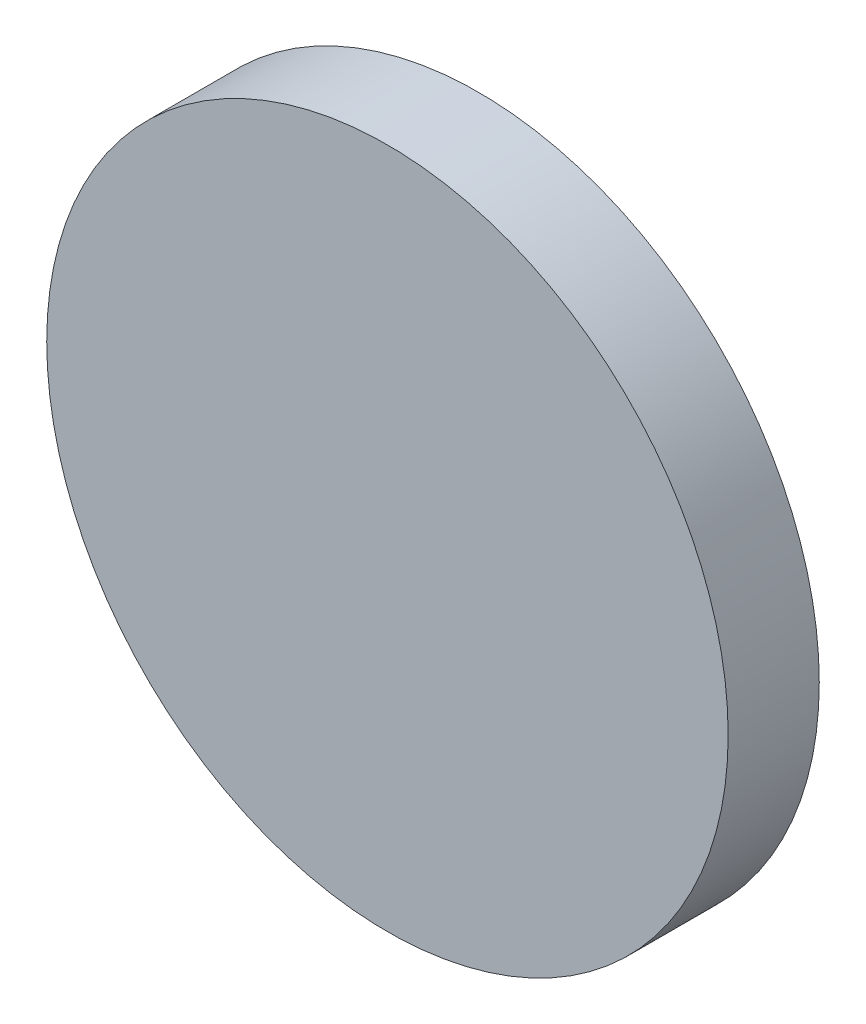
ISO-10303-21;
HEADER;
FILE_DESCRIPTION(('STEP AP214'),'2;1');
FILE_NAME('part.step','',(''),(''),'','','');
FILE_SCHEMA(('AUTOMOTIVE_DESIGN { 1 0 10303 214 1 1 1 1 }'));
ENDSEC;
DATA;
#1=APPLICATION_CONTEXT('core data for automotive mechanical design processes');
#2=APPLICATION_PROTOCOL_DEFINITION('international standard','automotive_design',2000,#1);
#3=PRODUCT_CONTEXT('',#1,'mechanical');
#4=PRODUCT('Part','Part','',(#3));
#5=PRODUCT_RELATED_PRODUCT_CATEGORY('part','',(#4));
#6=PRODUCT_DEFINITION_FORMATION('','',#4);
#7=PRODUCT_DEFINITION_CONTEXT('part definition',#1,'design');
#8=PRODUCT_DEFINITION('design','',#6,#7);
#9=PRODUCT_DEFINITION_SHAPE('','',#8);
#10=(LENGTH_UNIT() NAMED_UNIT(*) SI_UNIT(.MILLI.,.METRE.));
#11=(NAMED_UNIT(*) PLANE_ANGLE_UNIT() SI_UNIT($,.RADIAN.));
#12=(NAMED_UNIT(*) SI_UNIT($,.STERADIAN.) SOLID_ANGLE_UNIT());
#13=UNCERTAINTY_MEASURE_WITH_UNIT(LENGTH_MEASURE(1.E-05),#10,'distance_accuracy_value','');
#14=(GEOMETRIC_REPRESENTATION_CONTEXT(3) GLOBAL_UNCERTAINTY_ASSIGNED_CONTEXT((#13)) GLOBAL_UNIT_ASSIGNED_CONTEXT((#10,
#11,#12)) REPRESENTATION_CONTEXT('',''));
#15=CARTESIAN_POINT('',(0.,0.,0.));
#16=DIRECTION('',(0.,0.,1.));
#17=DIRECTION('',(1.,0.,0.));
#18=AXIS2_PLACEMENT_3D('',#15,#16,#17);
#19=CARTESIAN_POINT('',(0.,0.,3.175));
#20=DIRECTION('',(0.,0.,-1.));
#21=DIRECTION('',(-1.,0.,0.));
#22=AXIS2_PLACEMENT_3D('',#19,#20,#21);
#23=CYLINDRICAL_SURFACE('',#22,11.8745);
#24=CARTESIAN_POINT('',(0.,0.,3.175));
#25=DIRECTION('',(0.,0.,1.));
#26=DIRECTION('',(1.,0.,0.));
#27=AXIS2_PLACEMENT_3D('',#24,#25,#26);
#28=CIRCLE('',#27,11.8745);
#29=CARTESIAN_POINT('',(11.8745,0.,3.175));
#30=VERTEX_POINT('',#29);
#31=EDGE_CURVE('E11',#30,#30,#28,.T.);
#32=ORIENTED_EDGE('',*,*,#31,.F.);
#33=EDGE_LOOP('',(#32));
#34=FACE_BOUND('',#33,.T.);
#35=CARTESIAN_POINT('',(0.,0.,0.));
#36=DIRECTION('',(0.,0.,1.));
#37=DIRECTION('',(1.,0.,0.));
#38=AXIS2_PLACEMENT_3D('',#35,#36,#37);
#39=CIRCLE('',#38,11.8745);
#40=CARTESIAN_POINT('',(11.8745,0.,0.));
#41=VERTEX_POINT('',#40);
#42=EDGE_CURVE('E40',#41,#41,#39,.T.);
#43=ORIENTED_EDGE('',*,*,#42,.T.);
#44=EDGE_LOOP('',(#43));
#45=FACE_BOUND('',#44,.T.);
#46=ADVANCED_FACE('F37',(#34,#45),#23,.T.);
#47=CARTESIAN_POINT('',(0.,0.,3.175));
#48=DIRECTION('',(0.,0.,1.));
#49=DIRECTION('',(1.,0.,0.));
#50=AXIS2_PLACEMENT_3D('',#47,#48,#49);
#51=PLANE('',#50);
#52=ORIENTED_EDGE('',*,*,#31,.T.);
#53=EDGE_LOOP('',(#52));
#54=FACE_BOUND('',#53,.T.);
#55=ADVANCED_FACE('F54',(#54),#51,.T.);
#56=CARTESIAN_POINT('',(0.,0.,0.));
#57=DIRECTION('',(0.,0.,1.));
#58=DIRECTION('',(1.,0.,0.));
#59=AXIS2_PLACEMENT_3D('',#56,#57,#58);
#60=PLANE('',#59);
#61=ORIENTED_EDGE('',*,*,#42,.F.);
#62=EDGE_LOOP('',(#61));
#63=FACE_BOUND('',#62,.T.);
#64=ADVANCED_FACE('F52',(#63),#60,.F.);
#65=CLOSED_SHELL('',(#46,#55,#64));
#66=MANIFOLD_SOLID_BREP('B2',#65);
#67=ADVANCED_BREP_SHAPE_REPRESENTATION('',(#18,#66),#14);
#68=SHAPE_DEFINITION_REPRESENTATION(#9,#67);
ENDSEC;
END-ISO-10303-21;
